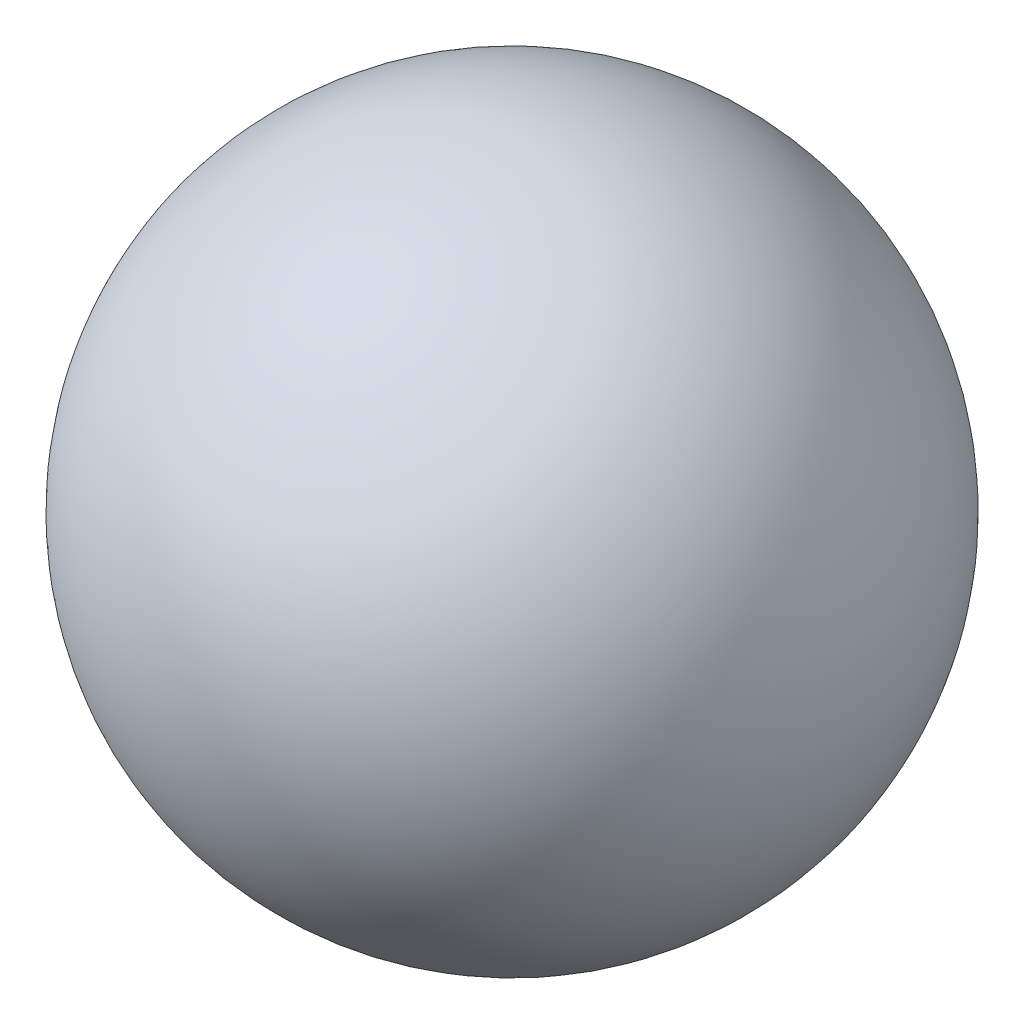
ISO-10303-21;
HEADER;
FILE_DESCRIPTION(('STEP AP214'),'2;1');
FILE_NAME('part.step','',(''),(''),'','','');
FILE_SCHEMA(('AUTOMOTIVE_DESIGN { 1 0 10303 214 1 1 1 1 }'));
ENDSEC;
DATA;
#1=APPLICATION_CONTEXT('core data for automotive mechanical design processes');
#2=APPLICATION_PROTOCOL_DEFINITION('international standard','automotive_design',2000,#1);
#3=PRODUCT_CONTEXT('',#1,'mechanical');
#4=PRODUCT('Part','Part','',(#3));
#5=PRODUCT_RELATED_PRODUCT_CATEGORY('part','',(#4));
#6=PRODUCT_DEFINITION_FORMATION('','',#4);
#7=PRODUCT_DEFINITION_CONTEXT('part definition',#1,'design');
#8=PRODUCT_DEFINITION('design','',#6,#7);
#9=PRODUCT_DEFINITION_SHAPE('','',#8);
#10=(LENGTH_UNIT() NAMED_UNIT(*) SI_UNIT(.MILLI.,.METRE.));
#11=(NAMED_UNIT(*) PLANE_ANGLE_UNIT() SI_UNIT($,.RADIAN.));
#12=(NAMED_UNIT(*) SI_UNIT($,.STERADIAN.) SOLID_ANGLE_UNIT());
#13=UNCERTAINTY_MEASURE_WITH_UNIT(LENGTH_MEASURE(1.E-05),#10,'distance_accuracy_value','');
#14=(GEOMETRIC_REPRESENTATION_CONTEXT(3) GLOBAL_UNCERTAINTY_ASSIGNED_CONTEXT((#13)) GLOBAL_UNIT_ASSIGNED_CONTEXT((#10,
#11,#12)) REPRESENTATION_CONTEXT('',''));
#15=CARTESIAN_POINT('',(0.,0.,0.));
#16=DIRECTION('',(0.,0.,1.));
#17=DIRECTION('',(1.,0.,0.));
#18=AXIS2_PLACEMENT_3D('',#15,#16,#17);
#19=CARTESIAN_POINT('',(0.,11.75,0.));
#20=DIRECTION('',(1.,0.,0.));
#21=DIRECTION('',(0.,-1.,0.));
#22=AXIS2_PLACEMENT_3D('',#19,#20,#21);
#23=SPHERICAL_SURFACE('',#22,2.42857142857143);
#24=CARTESIAN_POINT('',(2.42857142857143,11.75,0.));
#25=VERTEX_POINT('',#24);
#26=VERTEX_LOOP('',#25);
#27=FACE_BOUND('',#26,.T.);
#28=ADVANCED_FACE('F346',(#27),#23,.T.);
#29=CLOSED_SHELL('',(#28));
#30=MANIFOLD_SOLID_BREP('B2',#29);
#31=ADVANCED_BREP_SHAPE_REPRESENTATION('',(#18,#30),#14);
#32=SHAPE_DEFINITION_REPRESENTATION(#9,#31);
ENDSEC;
END-ISO-10303-21;
